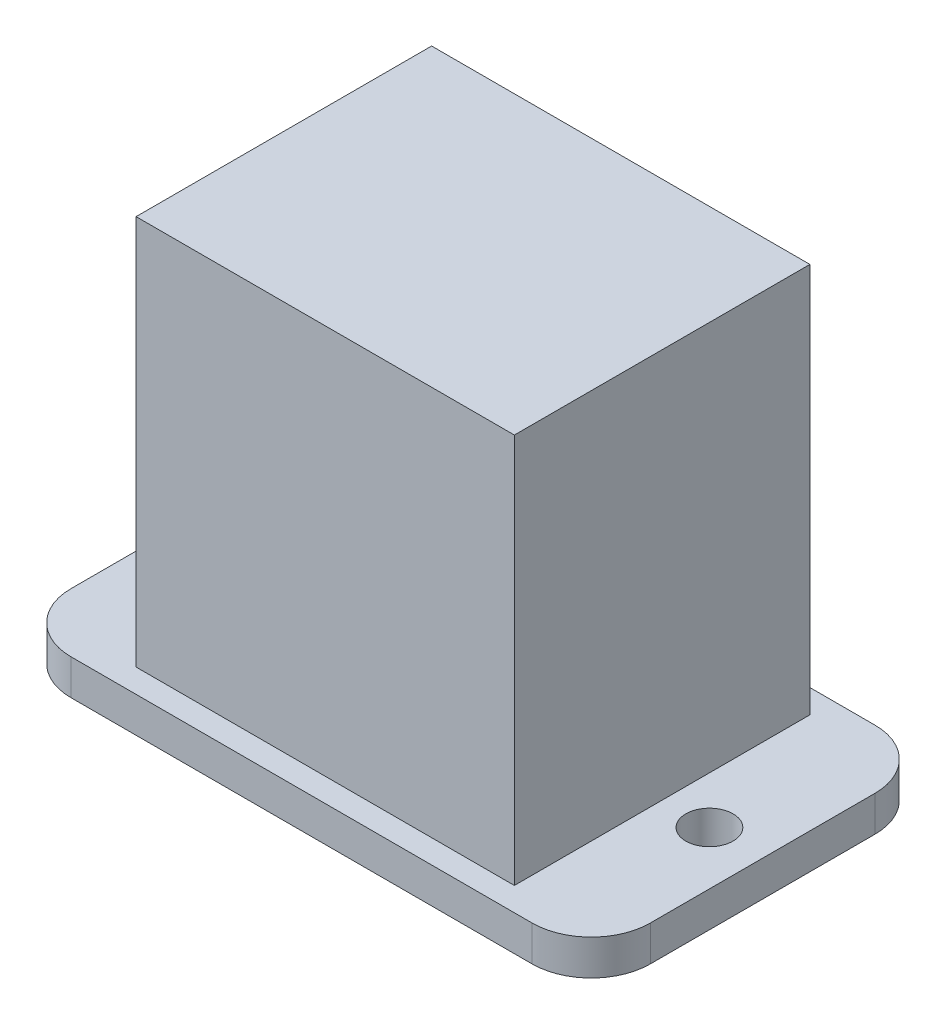
ISO-10303-21;
HEADER;
FILE_DESCRIPTION(('STEP AP214'),'2;1');
FILE_NAME('part.step','',(''),(''),'','','');
FILE_SCHEMA(('AUTOMOTIVE_DESIGN { 1 0 10303 214 1 1 1 1 }'));
ENDSEC;
DATA;
#1=APPLICATION_CONTEXT('core data for automotive mechanical design processes');
#2=APPLICATION_PROTOCOL_DEFINITION('international standard','automotive_design',2000,#1);
#3=PRODUCT_CONTEXT('',#1,'mechanical');
#4=PRODUCT('Part','Part','',(#3));
#5=PRODUCT_RELATED_PRODUCT_CATEGORY('part','',(#4));
#6=PRODUCT_DEFINITION_FORMATION('','',#4);
#7=PRODUCT_DEFINITION_CONTEXT('part definition',#1,'design');
#8=PRODUCT_DEFINITION('design','',#6,#7);
#9=PRODUCT_DEFINITION_SHAPE('','',#8);
#10=(LENGTH_UNIT() NAMED_UNIT(*) SI_UNIT(.MILLI.,.METRE.));
#11=(NAMED_UNIT(*) PLANE_ANGLE_UNIT() SI_UNIT($,.RADIAN.));
#12=(NAMED_UNIT(*) SI_UNIT($,.STERADIAN.) SOLID_ANGLE_UNIT());
#13=UNCERTAINTY_MEASURE_WITH_UNIT(LENGTH_MEASURE(1.E-05),#10,'distance_accuracy_value','');
#14=(GEOMETRIC_REPRESENTATION_CONTEXT(3) GLOBAL_UNCERTAINTY_ASSIGNED_CONTEXT((#13)) GLOBAL_UNIT_ASSIGNED_CONTEXT((#10,
#11,#12)) REPRESENTATION_CONTEXT('',''));
#15=CARTESIAN_POINT('',(0.,0.,0.));
#16=DIRECTION('',(0.,0.,1.));
#17=DIRECTION('',(1.,0.,0.));
#18=AXIS2_PLACEMENT_3D('',#15,#16,#17);
#19=CARTESIAN_POINT('',(5.,3.,-24.));
#20=DIRECTION('',(0.,-1.,0.));
#21=DIRECTION('',(0.,0.,-1.));
#22=AXIS2_PLACEMENT_3D('',#19,#20,#21);
#23=PLANE('',#22);
#24=CARTESIAN_POINT('',(44.5,3.,-14.5));
#25=DIRECTION('',(0.,1.,0.));
#26=DIRECTION('',(0.,0.,1.));
#27=AXIS2_PLACEMENT_3D('',#24,#25,#26);
#28=CIRCLE('',#27,2.);
#29=CARTESIAN_POINT('',(44.5,3.,-12.5));
#30=VERTEX_POINT('',#29);
#31=EDGE_CURVE('E146',#30,#30,#28,.T.);
#32=ORIENTED_EDGE('',*,*,#31,.F.);
#33=EDGE_LOOP('',(#32));
#34=FACE_BOUND('',#33,.T.);
#35=CARTESIAN_POINT('',(5.,3.,-24.));
#36=DIRECTION('',(0.,1.,0.));
#37=DIRECTION('',(0.,0.,-1.));
#38=AXIS2_PLACEMENT_3D('',#35,#36,#37);
#39=CIRCLE('',#38,5.);
#40=CARTESIAN_POINT('',(5.00000000000004,3.,-29.));
#41=VERTEX_POINT('',#40);
#42=CARTESIAN_POINT('',(0.,3.,-24.));
#43=VERTEX_POINT('',#42);
#44=EDGE_CURVE('E161',#41,#43,#39,.T.);
#45=ORIENTED_EDGE('',*,*,#44,.T.);
#46=DIRECTION('',(0.,0.,1.));
#47=VECTOR('',#46,1.);
#48=CARTESIAN_POINT('',(0.,3.,-5.00000000000004));
#49=LINE('',#48,#47);
#50=CARTESIAN_POINT('',(0.,3.,-5.00000000000004));
#51=VERTEX_POINT('',#50);
#52=EDGE_CURVE('E164',#43,#51,#49,.T.);
#53=ORIENTED_EDGE('',*,*,#52,.T.);
#54=CARTESIAN_POINT('',(5.,3.,-5.));
#55=DIRECTION('',(0.,1.,0.));
#56=DIRECTION('',(0.,0.,-1.));
#57=AXIS2_PLACEMENT_3D('',#54,#55,#56);
#58=CIRCLE('',#57,5.);
#59=CARTESIAN_POINT('',(5.00000000000004,3.,0.));
#60=VERTEX_POINT('',#59);
#61=EDGE_CURVE('E167',#51,#60,#58,.T.);
#62=ORIENTED_EDGE('',*,*,#61,.T.);
#63=DIRECTION('',(1.,0.,0.));
#64=VECTOR('',#63,1.);
#65=CARTESIAN_POINT('',(5.00000000000004,3.,0.));
#66=LINE('',#65,#64);
#67=CARTESIAN_POINT('',(44.,3.,0.));
#68=VERTEX_POINT('',#67);
#69=EDGE_CURVE('E169',#60,#68,#66,.T.);
#70=ORIENTED_EDGE('',*,*,#69,.T.);
#71=CARTESIAN_POINT('',(44.,3.,-5.));
#72=DIRECTION('',(0.,1.,0.));
#73=DIRECTION('',(0.,0.,1.));
#74=AXIS2_PLACEMENT_3D('',#71,#72,#73);
#75=CIRCLE('',#74,5.);
#76=CARTESIAN_POINT('',(49.,3.,-5.00000000000003));
#77=VERTEX_POINT('',#76);
#78=EDGE_CURVE('E171',#68,#77,#75,.T.);
#79=ORIENTED_EDGE('',*,*,#78,.T.);
#80=DIRECTION('',(0.,0.,-1.));
#81=VECTOR('',#80,1.);
#82=CARTESIAN_POINT('',(49.,3.,-5.00000000000003));
#83=LINE('',#82,#81);
#84=CARTESIAN_POINT('',(49.,3.,-24.));
#85=VERTEX_POINT('',#84);
#86=EDGE_CURVE('E173',#77,#85,#83,.T.);
#87=ORIENTED_EDGE('',*,*,#86,.T.);
#88=CARTESIAN_POINT('',(44.,3.,-24.));
#89=DIRECTION('',(0.,1.,0.));
#90=DIRECTION('',(0.,0.,-1.));
#91=AXIS2_PLACEMENT_3D('',#88,#89,#90);
#92=CIRCLE('',#91,5.);
#93=CARTESIAN_POINT('',(44.,3.,-29.));
#94=VERTEX_POINT('',#93);
#95=EDGE_CURVE('E175',#85,#94,#92,.T.);
#96=ORIENTED_EDGE('',*,*,#95,.T.);
#97=DIRECTION('',(-1.,0.,0.));
#98=VECTOR('',#97,1.);
#99=CARTESIAN_POINT('',(5.00000000000004,3.,-29.));
#100=LINE('',#99,#98);
#101=EDGE_CURVE('E177',#94,#41,#100,.T.);
#102=ORIENTED_EDGE('',*,*,#101,.T.);
#103=EDGE_LOOP('',(#45,#53,#62,#70,#79,#87,#96,#102));
#104=FACE_BOUND('',#103,.T.);
#105=CARTESIAN_POINT('',(4.5,3.,-14.5));
#106=DIRECTION('',(0.,1.,0.));
#107=DIRECTION('',(0.,0.,1.));
#108=AXIS2_PLACEMENT_3D('',#105,#106,#107);
#109=CIRCLE('',#108,2.);
#110=CARTESIAN_POINT('',(4.5,3.,-12.5));
#111=VERTEX_POINT('',#110);
#112=EDGE_CURVE('E155',#111,#111,#109,.T.);
#113=ORIENTED_EDGE('',*,*,#112,.F.);
#114=EDGE_LOOP('',(#113));
#115=FACE_BOUND('',#114,.T.);
#116=DIRECTION('',(0.,0.,1.));
#117=VECTOR('',#116,1.);
#118=CARTESIAN_POINT('',(8.5,3.,-27.));
#119=LINE('',#118,#117);
#120=CARTESIAN_POINT('',(8.5,3.,-27.));
#121=VERTEX_POINT('',#120);
#122=CARTESIAN_POINT('',(8.5,3.,-2.));
#123=VERTEX_POINT('',#122);
#124=EDGE_CURVE('E142',#121,#123,#119,.T.);
#125=ORIENTED_EDGE('',*,*,#124,.F.);
#126=DIRECTION('',(-1.,0.,0.));
#127=VECTOR('',#126,1.);
#128=CARTESIAN_POINT('',(8.5,3.,-27.));
#129=LINE('',#128,#127);
#130=CARTESIAN_POINT('',(40.5,3.,-27.));
#131=VERTEX_POINT('',#130);
#132=EDGE_CURVE('E139',#131,#121,#129,.T.);
#133=ORIENTED_EDGE('',*,*,#132,.F.);
#134=DIRECTION('',(0.,0.,-1.));
#135=VECTOR('',#134,1.);
#136=CARTESIAN_POINT('',(40.5,3.,-27.));
#137=LINE('',#136,#135);
#138=CARTESIAN_POINT('',(40.5,3.,-2.));
#139=VERTEX_POINT('',#138);
#140=EDGE_CURVE('E53',#139,#131,#137,.T.);
#141=ORIENTED_EDGE('',*,*,#140,.F.);
#142=DIRECTION('',(1.,0.,0.));
#143=VECTOR('',#142,1.);
#144=CARTESIAN_POINT('',(8.5,3.,-2.));
#145=LINE('',#144,#143);
#146=EDGE_CURVE('E48',#123,#139,#145,.T.);
#147=ORIENTED_EDGE('',*,*,#146,.F.);
#148=EDGE_LOOP('',(#125,#133,#141,#147));
#149=FACE_BOUND('',#148,.T.);
#150=ADVANCED_FACE('F33',(#34,#104,#115,#149),#23,.F.);
#151=CARTESIAN_POINT('',(5.,0.,-24.));
#152=DIRECTION('',(0.,-1.,0.));
#153=DIRECTION('',(0.,0.,-1.));
#154=AXIS2_PLACEMENT_3D('',#151,#152,#153);
#155=PLANE('',#154);
#156=CARTESIAN_POINT('',(4.5,0.,-14.5));
#157=DIRECTION('',(0.,1.,0.));
#158=DIRECTION('',(0.,0.,1.));
#159=AXIS2_PLACEMENT_3D('',#156,#157,#158);
#160=CIRCLE('',#159,2.);
#161=CARTESIAN_POINT('',(4.5,0.,-12.5));
#162=VERTEX_POINT('',#161);
#163=EDGE_CURVE('E153',#162,#162,#160,.T.);
#164=ORIENTED_EDGE('',*,*,#163,.T.);
#165=EDGE_LOOP('',(#164));
#166=FACE_BOUND('',#165,.T.);
#167=CARTESIAN_POINT('',(5.,0.,-24.));
#168=DIRECTION('',(0.,1.,0.));
#169=DIRECTION('',(0.,0.,-1.));
#170=AXIS2_PLACEMENT_3D('',#167,#168,#169);
#171=CIRCLE('',#170,5.);
#172=CARTESIAN_POINT('',(5.00000000000004,0.,-29.));
#173=VERTEX_POINT('',#172);
#174=CARTESIAN_POINT('',(0.,0.,-24.));
#175=VERTEX_POINT('',#174);
#176=EDGE_CURVE('E158',#173,#175,#171,.T.);
#177=ORIENTED_EDGE('',*,*,#176,.F.);
#178=DIRECTION('',(-1.,0.,0.));
#179=VECTOR('',#178,1.);
#180=CARTESIAN_POINT('',(5.00000000000004,0.,-29.));
#181=LINE('',#180,#179);
#182=CARTESIAN_POINT('',(44.,0.,-29.));
#183=VERTEX_POINT('',#182);
#184=EDGE_CURVE('E165',#183,#173,#181,.T.);
#185=ORIENTED_EDGE('',*,*,#184,.F.);
#186=CARTESIAN_POINT('',(44.,0.,-24.));
#187=DIRECTION('',(0.,1.,0.));
#188=DIRECTION('',(0.,0.,-1.));
#189=AXIS2_PLACEMENT_3D('',#186,#187,#188);
#190=CIRCLE('',#189,5.);
#191=CARTESIAN_POINT('',(49.,0.,-24.));
#192=VERTEX_POINT('',#191);
#193=EDGE_CURVE('E192',#192,#183,#190,.T.);
#194=ORIENTED_EDGE('',*,*,#193,.F.);
#195=DIRECTION('',(0.,0.,-1.));
#196=VECTOR('',#195,1.);
#197=CARTESIAN_POINT('',(49.,0.,-5.00000000000003));
#198=LINE('',#197,#196);
#199=CARTESIAN_POINT('',(49.,0.,-5.00000000000003));
#200=VERTEX_POINT('',#199);
#201=EDGE_CURVE('E190',#200,#192,#198,.T.);
#202=ORIENTED_EDGE('',*,*,#201,.F.);
#203=CARTESIAN_POINT('',(44.,0.,-5.));
#204=DIRECTION('',(0.,1.,0.));
#205=DIRECTION('',(0.,0.,1.));
#206=AXIS2_PLACEMENT_3D('',#203,#204,#205);
#207=CIRCLE('',#206,5.);
#208=CARTESIAN_POINT('',(44.,0.,0.));
#209=VERTEX_POINT('',#208);
#210=EDGE_CURVE('E188',#209,#200,#207,.T.);
#211=ORIENTED_EDGE('',*,*,#210,.F.);
#212=DIRECTION('',(1.,0.,0.));
#213=VECTOR('',#212,1.);
#214=CARTESIAN_POINT('',(5.00000000000004,0.,0.));
#215=LINE('',#214,#213);
#216=CARTESIAN_POINT('',(5.00000000000004,0.,0.));
#217=VERTEX_POINT('',#216);
#218=EDGE_CURVE('E186',#217,#209,#215,.T.);
#219=ORIENTED_EDGE('',*,*,#218,.F.);
#220=CARTESIAN_POINT('',(5.,0.,-5.));
#221=DIRECTION('',(0.,1.,0.));
#222=DIRECTION('',(0.,0.,-1.));
#223=AXIS2_PLACEMENT_3D('',#220,#221,#222);
#224=CIRCLE('',#223,5.);
#225=CARTESIAN_POINT('',(0.,0.,-5.00000000000004));
#226=VERTEX_POINT('',#225);
#227=EDGE_CURVE('E184',#226,#217,#224,.T.);
#228=ORIENTED_EDGE('',*,*,#227,.F.);
#229=DIRECTION('',(0.,0.,1.));
#230=VECTOR('',#229,1.);
#231=CARTESIAN_POINT('',(0.,0.,-5.00000000000004));
#232=LINE('',#231,#230);
#233=EDGE_CURVE('E182',#175,#226,#232,.T.);
#234=ORIENTED_EDGE('',*,*,#233,.F.);
#235=EDGE_LOOP('',(#177,#185,#194,#202,#211,#219,#228,#234));
#236=FACE_BOUND('',#235,.T.);
#237=CARTESIAN_POINT('',(44.5,0.,-14.5));
#238=DIRECTION('',(0.,1.,0.));
#239=DIRECTION('',(0.,0.,1.));
#240=AXIS2_PLACEMENT_3D('',#237,#238,#239);
#241=CIRCLE('',#240,2.);
#242=CARTESIAN_POINT('',(44.5,0.,-12.5));
#243=VERTEX_POINT('',#242);
#244=EDGE_CURVE('E143',#243,#243,#241,.T.);
#245=ORIENTED_EDGE('',*,*,#244,.T.);
#246=EDGE_LOOP('',(#245));
#247=FACE_BOUND('',#246,.T.);
#248=ADVANCED_FACE('F222',(#166,#236,#247),#155,.T.);
#249=CARTESIAN_POINT('',(5.,3.,-24.));
#250=DIRECTION('',(0.,-1.,0.));
#251=DIRECTION('',(0.,0.,-1.));
#252=AXIS2_PLACEMENT_3D('',#249,#250,#251);
#253=CYLINDRICAL_SURFACE('',#252,5.);
#254=ORIENTED_EDGE('',*,*,#176,.T.);
#255=DIRECTION('',(0.,-1.,0.));
#256=VECTOR('',#255,1.);
#257=CARTESIAN_POINT('',(0.,3.,-24.));
#258=LINE('',#257,#256);
#259=EDGE_CURVE('E11',#43,#175,#258,.T.);
#260=ORIENTED_EDGE('',*,*,#259,.F.);
#261=ORIENTED_EDGE('',*,*,#44,.F.);
#262=DIRECTION('',(0.,-1.,0.));
#263=VECTOR('',#262,1.);
#264=CARTESIAN_POINT('',(5.00000000000004,3.,-29.));
#265=LINE('',#264,#263);
#266=EDGE_CURVE('E179',#41,#173,#265,.T.);
#267=ORIENTED_EDGE('',*,*,#266,.T.);
#268=EDGE_LOOP('',(#254,#260,#261,#267));
#269=FACE_BOUND('',#268,.T.);
#270=ADVANCED_FACE('F35',(#269),#253,.T.);
#271=CARTESIAN_POINT('',(0.,3.,-5.00000000000004));
#272=DIRECTION('',(1.,0.,0.));
#273=DIRECTION('',(0.,0.,-1.));
#274=AXIS2_PLACEMENT_3D('',#271,#272,#273);
#275=PLANE('',#274);
#276=ORIENTED_EDGE('',*,*,#233,.T.);
#277=DIRECTION('',(0.,-1.,0.));
#278=VECTOR('',#277,1.);
#279=CARTESIAN_POINT('',(0.,3.,-5.00000000000004));
#280=LINE('',#279,#278);
#281=EDGE_CURVE('E41',#51,#226,#280,.T.);
#282=ORIENTED_EDGE('',*,*,#281,.F.);
#283=ORIENTED_EDGE('',*,*,#52,.F.);
#284=ORIENTED_EDGE('',*,*,#259,.T.);
#285=EDGE_LOOP('',(#276,#282,#283,#284));
#286=FACE_BOUND('',#285,.T.);
#287=ADVANCED_FACE('F240',(#286),#275,.F.);
#288=CARTESIAN_POINT('',(5.,3.,-5.));
#289=DIRECTION('',(0.,-1.,0.));
#290=DIRECTION('',(0.,0.,-1.));
#291=AXIS2_PLACEMENT_3D('',#288,#289,#290);
#292=CYLINDRICAL_SURFACE('',#291,5.);
#293=ORIENTED_EDGE('',*,*,#227,.T.);
#294=DIRECTION('',(0.,-1.,0.));
#295=VECTOR('',#294,1.);
#296=CARTESIAN_POINT('',(5.00000000000004,3.,0.));
#297=LINE('',#296,#295);
#298=EDGE_CURVE('E209',#60,#217,#297,.T.);
#299=ORIENTED_EDGE('',*,*,#298,.F.);
#300=ORIENTED_EDGE('',*,*,#61,.F.);
#301=ORIENTED_EDGE('',*,*,#281,.T.);
#302=EDGE_LOOP('',(#293,#299,#300,#301));
#303=FACE_BOUND('',#302,.T.);
#304=ADVANCED_FACE('F216',(#303),#292,.T.);
#305=CARTESIAN_POINT('',(5.00000000000004,3.,0.));
#306=DIRECTION('',(0.,0.,-1.));
#307=DIRECTION('',(-1.,0.,0.));
#308=AXIS2_PLACEMENT_3D('',#305,#306,#307);
#309=PLANE('',#308);
#310=ORIENTED_EDGE('',*,*,#218,.T.);
#311=DIRECTION('',(0.,-1.,0.));
#312=VECTOR('',#311,1.);
#313=CARTESIAN_POINT('',(44.,3.,0.));
#314=LINE('',#313,#312);
#315=EDGE_CURVE('E206',#68,#209,#314,.T.);
#316=ORIENTED_EDGE('',*,*,#315,.F.);
#317=ORIENTED_EDGE('',*,*,#69,.F.);
#318=ORIENTED_EDGE('',*,*,#298,.T.);
#319=EDGE_LOOP('',(#310,#316,#317,#318));
#320=FACE_BOUND('',#319,.T.);
#321=ADVANCED_FACE('F228',(#320),#309,.F.);
#322=CARTESIAN_POINT('',(44.,3.,-5.));
#323=DIRECTION('',(0.,-1.,0.));
#324=DIRECTION('',(0.,0.,-1.));
#325=AXIS2_PLACEMENT_3D('',#322,#323,#324);
#326=CYLINDRICAL_SURFACE('',#325,5.);
#327=ORIENTED_EDGE('',*,*,#210,.T.);
#328=DIRECTION('',(0.,-1.,0.));
#329=VECTOR('',#328,1.);
#330=CARTESIAN_POINT('',(49.,3.,-5.00000000000003));
#331=LINE('',#330,#329);
#332=EDGE_CURVE('E203',#77,#200,#331,.T.);
#333=ORIENTED_EDGE('',*,*,#332,.F.);
#334=ORIENTED_EDGE('',*,*,#78,.F.);
#335=ORIENTED_EDGE('',*,*,#315,.T.);
#336=EDGE_LOOP('',(#327,#333,#334,#335));
#337=FACE_BOUND('',#336,.T.);
#338=ADVANCED_FACE('F232',(#337),#326,.T.);
#339=CARTESIAN_POINT('',(49.,3.,-5.00000000000003));
#340=DIRECTION('',(-1.,0.,0.));
#341=DIRECTION('',(0.,0.,1.));
#342=AXIS2_PLACEMENT_3D('',#339,#340,#341);
#343=PLANE('',#342);
#344=ORIENTED_EDGE('',*,*,#201,.T.);
#345=DIRECTION('',(0.,-1.,0.));
#346=VECTOR('',#345,1.);
#347=CARTESIAN_POINT('',(49.,3.,-24.));
#348=LINE('',#347,#346);
#349=EDGE_CURVE('E200',#85,#192,#348,.T.);
#350=ORIENTED_EDGE('',*,*,#349,.F.);
#351=ORIENTED_EDGE('',*,*,#86,.F.);
#352=ORIENTED_EDGE('',*,*,#332,.T.);
#353=EDGE_LOOP('',(#344,#350,#351,#352));
#354=FACE_BOUND('',#353,.T.);
#355=ADVANCED_FACE('F253',(#354),#343,.F.);
#356=CARTESIAN_POINT('',(44.,3.,-24.));
#357=DIRECTION('',(0.,-1.,0.));
#358=DIRECTION('',(0.,0.,-1.));
#359=AXIS2_PLACEMENT_3D('',#356,#357,#358);
#360=CYLINDRICAL_SURFACE('',#359,5.);
#361=ORIENTED_EDGE('',*,*,#193,.T.);
#362=DIRECTION('',(0.,-1.,0.));
#363=VECTOR('',#362,1.);
#364=CARTESIAN_POINT('',(44.,3.,-29.));
#365=LINE('',#364,#363);
#366=EDGE_CURVE('E197',#94,#183,#365,.T.);
#367=ORIENTED_EDGE('',*,*,#366,.F.);
#368=ORIENTED_EDGE('',*,*,#95,.F.);
#369=ORIENTED_EDGE('',*,*,#349,.T.);
#370=EDGE_LOOP('',(#361,#367,#368,#369));
#371=FACE_BOUND('',#370,.T.);
#372=ADVANCED_FACE('F251',(#371),#360,.T.);
#373=CARTESIAN_POINT('',(5.00000000000004,3.,-29.));
#374=DIRECTION('',(0.,0.,1.));
#375=DIRECTION('',(1.,0.,0.));
#376=AXIS2_PLACEMENT_3D('',#373,#374,#375);
#377=PLANE('',#376);
#378=ORIENTED_EDGE('',*,*,#184,.T.);
#379=ORIENTED_EDGE('',*,*,#266,.F.);
#380=ORIENTED_EDGE('',*,*,#101,.F.);
#381=ORIENTED_EDGE('',*,*,#366,.T.);
#382=EDGE_LOOP('',(#378,#379,#380,#381));
#383=FACE_BOUND('',#382,.T.);
#384=ADVANCED_FACE('F246',(#383),#377,.F.);
#385=CARTESIAN_POINT('',(4.5,3.,-14.5));
#386=DIRECTION('',(0.,-1.,0.));
#387=DIRECTION('',(0.,0.,-1.));
#388=AXIS2_PLACEMENT_3D('',#385,#386,#387);
#389=CYLINDRICAL_SURFACE('',#388,2.);
#390=ORIENTED_EDGE('',*,*,#112,.T.);
#391=EDGE_LOOP('',(#390));
#392=FACE_BOUND('',#391,.T.);
#393=ORIENTED_EDGE('',*,*,#163,.F.);
#394=EDGE_LOOP('',(#393));
#395=FACE_BOUND('',#394,.T.);
#396=ADVANCED_FACE('F272',(#392,#395),#389,.F.);
#397=CARTESIAN_POINT('',(44.5,3.,-14.5));
#398=DIRECTION('',(0.,-1.,0.));
#399=DIRECTION('',(0.,0.,-1.));
#400=AXIS2_PLACEMENT_3D('',#397,#398,#399);
#401=CYLINDRICAL_SURFACE('',#400,2.);
#402=ORIENTED_EDGE('',*,*,#31,.T.);
#403=EDGE_LOOP('',(#402));
#404=FACE_BOUND('',#403,.T.);
#405=ORIENTED_EDGE('',*,*,#244,.F.);
#406=EDGE_LOOP('',(#405));
#407=FACE_BOUND('',#406,.T.);
#408=ADVANCED_FACE('F279',(#404,#407),#401,.F.);
#409=CARTESIAN_POINT('',(8.5,36.,-27.));
#410=DIRECTION('',(1.,0.,0.));
#411=DIRECTION('',(0.,0.,-1.));
#412=AXIS2_PLACEMENT_3D('',#409,#410,#411);
#413=PLANE('',#412);
#414=ORIENTED_EDGE('',*,*,#124,.T.);
#415=DIRECTION('',(0.,-1.,0.));
#416=VECTOR('',#415,1.);
#417=CARTESIAN_POINT('',(8.5,36.,-2.));
#418=LINE('',#417,#416);
#419=CARTESIAN_POINT('',(8.5,36.,-2.));
#420=VERTEX_POINT('',#419);
#421=EDGE_CURVE('E123',#420,#123,#418,.T.);
#422=ORIENTED_EDGE('',*,*,#421,.F.);
#423=DIRECTION('',(0.,0.,1.));
#424=VECTOR('',#423,1.);
#425=CARTESIAN_POINT('',(8.5,36.,-27.));
#426=LINE('',#425,#424);
#427=CARTESIAN_POINT('',(8.5,36.,-27.));
#428=VERTEX_POINT('',#427);
#429=EDGE_CURVE('E130',#428,#420,#426,.T.);
#430=ORIENTED_EDGE('',*,*,#429,.F.);
#431=DIRECTION('',(0.,-1.,0.));
#432=VECTOR('',#431,1.);
#433=CARTESIAN_POINT('',(8.5,36.,-27.));
#434=LINE('',#433,#432);
#435=EDGE_CURVE('E293',#428,#121,#434,.T.);
#436=ORIENTED_EDGE('',*,*,#435,.T.);
#437=EDGE_LOOP('',(#414,#422,#430,#436));
#438=FACE_BOUND('',#437,.T.);
#439=ADVANCED_FACE('F141',(#438),#413,.F.);
#440=CARTESIAN_POINT('',(8.5,36.,-2.));
#441=DIRECTION('',(0.,0.,-1.));
#442=DIRECTION('',(-1.,0.,0.));
#443=AXIS2_PLACEMENT_3D('',#440,#441,#442);
#444=PLANE('',#443);
#445=ORIENTED_EDGE('',*,*,#146,.T.);
#446=DIRECTION('',(0.,-1.,0.));
#447=VECTOR('',#446,1.);
#448=CARTESIAN_POINT('',(40.5,36.,-2.));
#449=LINE('',#448,#447);
#450=CARTESIAN_POINT('',(40.5,36.,-2.));
#451=VERTEX_POINT('',#450);
#452=EDGE_CURVE('E126',#451,#139,#449,.T.);
#453=ORIENTED_EDGE('',*,*,#452,.F.);
#454=DIRECTION('',(1.,0.,0.));
#455=VECTOR('',#454,1.);
#456=CARTESIAN_POINT('',(8.5,36.,-2.));
#457=LINE('',#456,#455);
#458=EDGE_CURVE('E119',#420,#451,#457,.T.);
#459=ORIENTED_EDGE('',*,*,#458,.F.);
#460=ORIENTED_EDGE('',*,*,#421,.T.);
#461=EDGE_LOOP('',(#445,#453,#459,#460));
#462=FACE_BOUND('',#461,.T.);
#463=ADVANCED_FACE('F121',(#462),#444,.F.);
#464=CARTESIAN_POINT('',(40.5,36.,-27.));
#465=DIRECTION('',(-1.,0.,0.));
#466=DIRECTION('',(0.,0.,1.));
#467=AXIS2_PLACEMENT_3D('',#464,#465,#466);
#468=PLANE('',#467);
#469=ORIENTED_EDGE('',*,*,#140,.T.);
#470=DIRECTION('',(0.,-1.,0.));
#471=VECTOR('',#470,1.);
#472=CARTESIAN_POINT('',(40.5,36.,-27.));
#473=LINE('',#472,#471);
#474=CARTESIAN_POINT('',(40.5,36.,-27.));
#475=VERTEX_POINT('',#474);
#476=EDGE_CURVE('E148',#475,#131,#473,.T.);
#477=ORIENTED_EDGE('',*,*,#476,.F.);
#478=DIRECTION('',(0.,0.,-1.));
#479=VECTOR('',#478,1.);
#480=CARTESIAN_POINT('',(40.5,36.,-27.));
#481=LINE('',#480,#479);
#482=EDGE_CURVE('E129',#451,#475,#481,.T.);
#483=ORIENTED_EDGE('',*,*,#482,.F.);
#484=ORIENTED_EDGE('',*,*,#452,.T.);
#485=EDGE_LOOP('',(#469,#477,#483,#484));
#486=FACE_BOUND('',#485,.T.);
#487=ADVANCED_FACE('F302',(#486),#468,.F.);
#488=CARTESIAN_POINT('',(8.5,36.,-27.));
#489=DIRECTION('',(0.,0.,1.));
#490=DIRECTION('',(1.,0.,0.));
#491=AXIS2_PLACEMENT_3D('',#488,#489,#490);
#492=PLANE('',#491);
#493=ORIENTED_EDGE('',*,*,#132,.T.);
#494=ORIENTED_EDGE('',*,*,#435,.F.);
#495=DIRECTION('',(-1.,0.,0.));
#496=VECTOR('',#495,1.);
#497=CARTESIAN_POINT('',(8.5,36.,-27.));
#498=LINE('',#497,#496);
#499=EDGE_CURVE('E135',#475,#428,#498,.T.);
#500=ORIENTED_EDGE('',*,*,#499,.F.);
#501=ORIENTED_EDGE('',*,*,#476,.T.);
#502=EDGE_LOOP('',(#493,#494,#500,#501));
#503=FACE_BOUND('',#502,.T.);
#504=ADVANCED_FACE('F292',(#503),#492,.F.);
#505=CARTESIAN_POINT('',(0.,36.,0.));
#506=DIRECTION('',(0.,1.,0.));
#507=DIRECTION('',(0.,0.,1.));
#508=AXIS2_PLACEMENT_3D('',#505,#506,#507);
#509=PLANE('',#508);
#510=ORIENTED_EDGE('',*,*,#429,.T.);
#511=ORIENTED_EDGE('',*,*,#458,.T.);
#512=ORIENTED_EDGE('',*,*,#482,.T.);
#513=ORIENTED_EDGE('',*,*,#499,.T.);
#514=EDGE_LOOP('',(#510,#511,#512,#513));
#515=FACE_BOUND('',#514,.T.);
#516=ADVANCED_FACE('F133',(#515),#509,.T.);
#517=CLOSED_SHELL('',(#150,#248,#270,#287,#304,#321,#338,#355,#372,#384,#396,#408,#439,#463,
#487,#504,#516));
#518=MANIFOLD_SOLID_BREP('B2',#517);
#519=ADVANCED_BREP_SHAPE_REPRESENTATION('',(#18,#518),#14);
#520=SHAPE_DEFINITION_REPRESENTATION(#9,#519);
ENDSEC;
END-ISO-10303-21;
